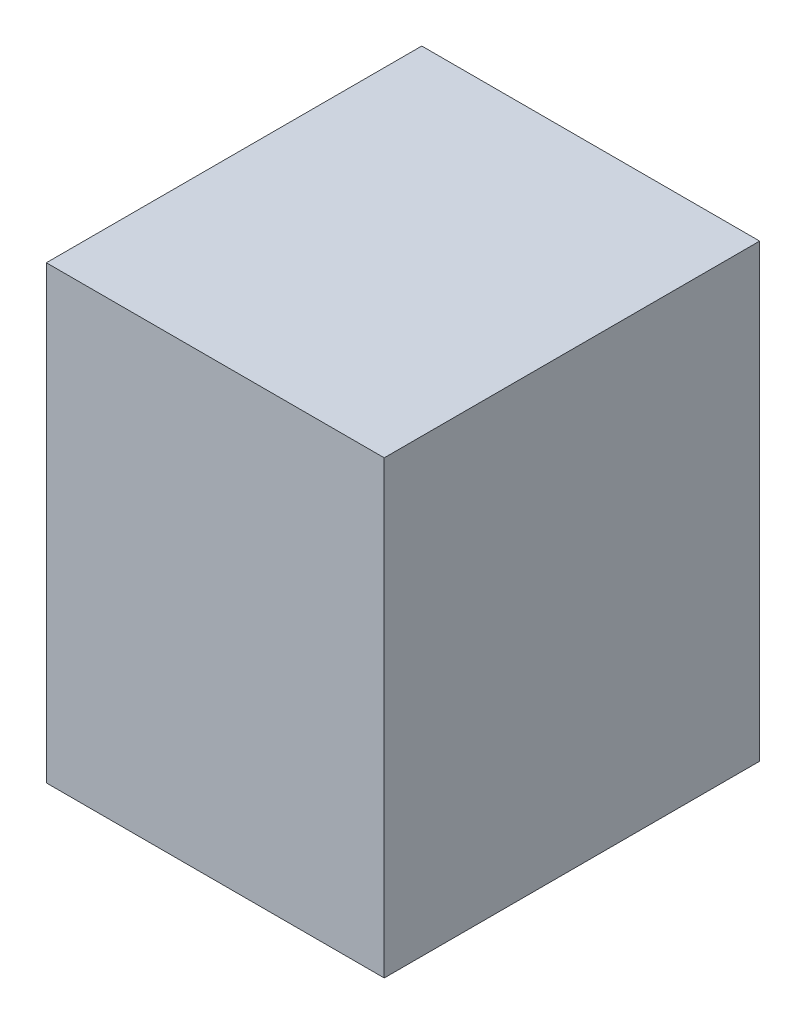
ISO-10303-21;
HEADER;
FILE_DESCRIPTION(('STEP AP214'),'2;1');
FILE_NAME('part.step','',(''),(''),'','','');
FILE_SCHEMA(('AUTOMOTIVE_DESIGN { 1 0 10303 214 1 1 1 1 }'));
ENDSEC;
DATA;
#1=APPLICATION_CONTEXT('core data for automotive mechanical design processes');
#2=APPLICATION_PROTOCOL_DEFINITION('international standard','automotive_design',2000,#1);
#3=PRODUCT_CONTEXT('',#1,'mechanical');
#4=PRODUCT('Part','Part','',(#3));
#5=PRODUCT_RELATED_PRODUCT_CATEGORY('part','',(#4));
#6=PRODUCT_DEFINITION_FORMATION('','',#4);
#7=PRODUCT_DEFINITION_CONTEXT('part definition',#1,'design');
#8=PRODUCT_DEFINITION('design','',#6,#7);
#9=PRODUCT_DEFINITION_SHAPE('','',#8);
#10=(LENGTH_UNIT() NAMED_UNIT(*) SI_UNIT(.MILLI.,.METRE.));
#11=(NAMED_UNIT(*) PLANE_ANGLE_UNIT() SI_UNIT($,.RADIAN.));
#12=(NAMED_UNIT(*) SI_UNIT($,.STERADIAN.) SOLID_ANGLE_UNIT());
#13=UNCERTAINTY_MEASURE_WITH_UNIT(LENGTH_MEASURE(1.E-05),#10,'distance_accuracy_value','');
#14=(GEOMETRIC_REPRESENTATION_CONTEXT(3) GLOBAL_UNCERTAINTY_ASSIGNED_CONTEXT((#13)) GLOBAL_UNIT_ASSIGNED_CONTEXT((#10,
#11,#12)) REPRESENTATION_CONTEXT('',''));
#15=CARTESIAN_POINT('',(0.,0.,0.));
#16=DIRECTION('',(0.,0.,1.));
#17=DIRECTION('',(1.,0.,0.));
#18=AXIS2_PLACEMENT_3D('',#15,#16,#17);
#19=CARTESIAN_POINT('',(0.,0.,63.5));
#20=DIRECTION('',(1.,0.,0.));
#21=DIRECTION('',(0.,0.,-1.));
#22=AXIS2_PLACEMENT_3D('',#19,#20,#21);
#23=PLANE('',#22);
#24=DIRECTION('',(0.,-1.,0.));
#25=VECTOR('',#24,1.);
#26=CARTESIAN_POINT('',(0.,0.,0.));
#27=LINE('',#26,#25);
#28=CARTESIAN_POINT('',(0.,76.2,0.));
#29=VERTEX_POINT('',#28);
#30=CARTESIAN_POINT('',(0.,0.,0.));
#31=VERTEX_POINT('',#30);
#32=EDGE_CURVE('E113',#29,#31,#27,.T.);
#33=ORIENTED_EDGE('',*,*,#32,.T.);
#34=DIRECTION('',(0.,0.,-1.));
#35=VECTOR('',#34,1.);
#36=CARTESIAN_POINT('',(0.,0.,63.5));
#37=LINE('',#36,#35);
#38=CARTESIAN_POINT('',(0.,0.,63.5));
#39=VERTEX_POINT('',#38);
#40=EDGE_CURVE('E11',#39,#31,#37,.T.);
#41=ORIENTED_EDGE('',*,*,#40,.F.);
#42=DIRECTION('',(0.,-1.,0.));
#43=VECTOR('',#42,1.);
#44=CARTESIAN_POINT('',(0.,0.,63.5));
#45=LINE('',#44,#43);
#46=CARTESIAN_POINT('',(0.,76.2,63.5));
#47=VERTEX_POINT('',#46);
#48=EDGE_CURVE('E97',#47,#39,#45,.T.);
#49=ORIENTED_EDGE('',*,*,#48,.F.);
#50=DIRECTION('',(0.,0.,-1.));
#51=VECTOR('',#50,1.);
#52=CARTESIAN_POINT('',(0.,76.2,63.5));
#53=LINE('',#52,#51);
#54=EDGE_CURVE('E109',#47,#29,#53,.T.);
#55=ORIENTED_EDGE('',*,*,#54,.T.);
#56=EDGE_LOOP('',(#33,#41,#49,#55));
#57=FACE_BOUND('',#56,.T.);
#58=ADVANCED_FACE('F45',(#57),#23,.F.);
#59=CARTESIAN_POINT('',(0.,0.,63.5));
#60=DIRECTION('',(0.,1.,0.));
#61=DIRECTION('',(0.,0.,1.));
#62=AXIS2_PLACEMENT_3D('',#59,#60,#61);
#63=PLANE('',#62);
#64=DIRECTION('',(1.,0.,0.));
#65=VECTOR('',#64,1.);
#66=CARTESIAN_POINT('',(0.,0.,0.));
#67=LINE('',#66,#65);
#68=CARTESIAN_POINT('',(57.15,0.,0.));
#69=VERTEX_POINT('',#68);
#70=EDGE_CURVE('E102',#31,#69,#67,.T.);
#71=ORIENTED_EDGE('',*,*,#70,.T.);
#72=DIRECTION('',(0.,0.,-1.));
#73=VECTOR('',#72,1.);
#74=CARTESIAN_POINT('',(57.15,0.,63.5));
#75=LINE('',#74,#73);
#76=CARTESIAN_POINT('',(57.15,0.,63.5));
#77=VERTEX_POINT('',#76);
#78=EDGE_CURVE('E54',#77,#69,#75,.T.);
#79=ORIENTED_EDGE('',*,*,#78,.F.);
#80=DIRECTION('',(1.,0.,0.));
#81=VECTOR('',#80,1.);
#82=CARTESIAN_POINT('',(0.,0.,63.5));
#83=LINE('',#82,#81);
#84=EDGE_CURVE('E92',#39,#77,#83,.T.);
#85=ORIENTED_EDGE('',*,*,#84,.F.);
#86=ORIENTED_EDGE('',*,*,#40,.T.);
#87=EDGE_LOOP('',(#71,#79,#85,#86));
#88=FACE_BOUND('',#87,.T.);
#89=ADVANCED_FACE('F101',(#88),#63,.F.);
#90=CARTESIAN_POINT('',(57.15,0.,63.5));
#91=DIRECTION('',(-1.,0.,0.));
#92=DIRECTION('',(0.,0.,1.));
#93=AXIS2_PLACEMENT_3D('',#90,#91,#92);
#94=PLANE('',#93);
#95=DIRECTION('',(0.,1.,0.));
#96=VECTOR('',#95,1.);
#97=CARTESIAN_POINT('',(57.15,0.,0.));
#98=LINE('',#97,#96);
#99=CARTESIAN_POINT('',(57.15,76.2,0.));
#100=VERTEX_POINT('',#99);
#101=EDGE_CURVE('E79',#69,#100,#98,.T.);
#102=ORIENTED_EDGE('',*,*,#101,.T.);
#103=DIRECTION('',(0.,0.,-1.));
#104=VECTOR('',#103,1.);
#105=CARTESIAN_POINT('',(57.15,76.2,63.5));
#106=LINE('',#105,#104);
#107=CARTESIAN_POINT('',(57.15,76.2,63.5));
#108=VERTEX_POINT('',#107);
#109=EDGE_CURVE('E104',#108,#100,#106,.T.);
#110=ORIENTED_EDGE('',*,*,#109,.F.);
#111=DIRECTION('',(0.,1.,0.));
#112=VECTOR('',#111,1.);
#113=CARTESIAN_POINT('',(57.15,0.,63.5));
#114=LINE('',#113,#112);
#115=EDGE_CURVE('E95',#77,#108,#114,.T.);
#116=ORIENTED_EDGE('',*,*,#115,.F.);
#117=ORIENTED_EDGE('',*,*,#78,.T.);
#118=EDGE_LOOP('',(#102,#110,#116,#117));
#119=FACE_BOUND('',#118,.T.);
#120=ADVANCED_FACE('F105',(#119),#94,.F.);
#121=CARTESIAN_POINT('',(0.,76.2,63.5));
#122=DIRECTION('',(0.,-1.,0.));
#123=DIRECTION('',(0.,0.,-1.));
#124=AXIS2_PLACEMENT_3D('',#121,#122,#123);
#125=PLANE('',#124);
#126=DIRECTION('',(-1.,0.,0.));
#127=VECTOR('',#126,1.);
#128=CARTESIAN_POINT('',(0.,76.2,0.));
#129=LINE('',#128,#127);
#130=EDGE_CURVE('E85',#100,#29,#129,.T.);
#131=ORIENTED_EDGE('',*,*,#130,.T.);
#132=ORIENTED_EDGE('',*,*,#54,.F.);
#133=DIRECTION('',(-1.,0.,0.));
#134=VECTOR('',#133,1.);
#135=CARTESIAN_POINT('',(0.,76.2,63.5));
#136=LINE('',#135,#134);
#137=EDGE_CURVE('E62',#108,#47,#136,.T.);
#138=ORIENTED_EDGE('',*,*,#137,.F.);
#139=ORIENTED_EDGE('',*,*,#109,.T.);
#140=EDGE_LOOP('',(#131,#132,#138,#139));
#141=FACE_BOUND('',#140,.T.);
#142=ADVANCED_FACE('F127',(#141),#125,.F.);
#143=CARTESIAN_POINT('',(0.,0.,63.5));
#144=DIRECTION('',(0.,0.,-1.));
#145=DIRECTION('',(-1.,0.,0.));
#146=AXIS2_PLACEMENT_3D('',#143,#144,#145);
#147=PLANE('',#146);
#148=ORIENTED_EDGE('',*,*,#48,.T.);
#149=ORIENTED_EDGE('',*,*,#84,.T.);
#150=ORIENTED_EDGE('',*,*,#115,.T.);
#151=ORIENTED_EDGE('',*,*,#137,.T.);
#152=EDGE_LOOP('',(#148,#149,#150,#151));
#153=FACE_BOUND('',#152,.T.);
#154=ADVANCED_FACE('F93',(#153),#147,.F.);
#155=CARTESIAN_POINT('',(0.,0.,0.));
#156=DIRECTION('',(0.,0.,-1.));
#157=DIRECTION('',(-1.,0.,0.));
#158=AXIS2_PLACEMENT_3D('',#155,#156,#157);
#159=PLANE('',#158);
#160=CARTESIAN_POINT('',(28.575,38.1,0.));
#161=DIRECTION('',(0.,0.,-1.));
#162=DIRECTION('',(-1.,0.,0.));
#163=AXIS2_PLACEMENT_3D('',#160,#161,#162);
#164=CIRCLE('',#163,22.225);
#165=CARTESIAN_POINT('',(6.35000000000001,38.1,0.));
#166=VERTEX_POINT('',#165);
#167=EDGE_CURVE('E134',#166,#166,#164,.T.);
#168=ORIENTED_EDGE('',*,*,#167,.F.);
#169=EDGE_LOOP('',(#168));
#170=FACE_BOUND('',#169,.T.);
#171=ORIENTED_EDGE('',*,*,#32,.F.);
#172=ORIENTED_EDGE('',*,*,#130,.F.);
#173=ORIENTED_EDGE('',*,*,#101,.F.);
#174=ORIENTED_EDGE('',*,*,#70,.F.);
#175=EDGE_LOOP('',(#171,#172,#173,#174));
#176=FACE_BOUND('',#175,.T.);
#177=ADVANCED_FACE('F130',(#170,#176),#159,.T.);
#178=CARTESIAN_POINT('',(28.575,38.1,29.21));
#179=DIRECTION('',(0.,0.,-1.));
#180=DIRECTION('',(-1.,0.,0.));
#181=AXIS2_PLACEMENT_3D('',#178,#179,#180);
#182=CYLINDRICAL_SURFACE('',#181,22.225);
#183=CARTESIAN_POINT('',(28.575,38.1,29.21));
#184=DIRECTION('',(0.,0.,-1.));
#185=DIRECTION('',(-1.,0.,0.));
#186=AXIS2_PLACEMENT_3D('',#183,#184,#185);
#187=CIRCLE('',#186,22.225);
#188=CARTESIAN_POINT('',(6.35000000000001,38.1,29.21));
#189=VERTEX_POINT('',#188);
#190=EDGE_CURVE('E117',#189,#189,#187,.T.);
#191=CARTESIAN_POINT('',(6.35000000000001,38.1,29.21));
#192=CARTESIAN_POINT('',(6.35000000000001,38.1,28.9057291666667));
#193=CARTESIAN_POINT('',(6.35000000000001,38.1,28.6014583333333));
#194=CARTESIAN_POINT('',(6.35000000000001,38.1,27.9929166666667));
#195=CARTESIAN_POINT('',(6.35000000000001,38.1,27.6886458333333));
#196=CARTESIAN_POINT('',(6.35000000000001,38.1,27.0801041666667));
#197=CARTESIAN_POINT('',(6.35000000000001,38.1,26.7758333333333));
#198=CARTESIAN_POINT('',(6.35000000000001,38.1,26.1672916666667));
#199=CARTESIAN_POINT('',(6.35000000000001,38.1,25.8630208333333));
#200=CARTESIAN_POINT('',(6.35000000000001,38.1,25.2544791666667));
#201=CARTESIAN_POINT('',(6.35000000000001,38.1,24.9502083333333));
#202=CARTESIAN_POINT('',(6.35000000000001,38.1,24.3416666666667));
#203=CARTESIAN_POINT('',(6.35000000000001,38.1,24.0373958333333));
#204=CARTESIAN_POINT('',(6.35000000000001,38.1,23.4288541666667));
#205=CARTESIAN_POINT('',(6.35000000000001,38.1,23.1245833333333));
#206=CARTESIAN_POINT('',(6.35000000000001,38.1,22.5160416666667));
#207=CARTESIAN_POINT('',(6.35000000000001,38.1,22.2117708333333));
#208=CARTESIAN_POINT('',(6.35000000000001,38.1,21.6032291666667));
#209=CARTESIAN_POINT('',(6.35000000000001,38.1,21.2989583333333));
#210=CARTESIAN_POINT('',(6.35000000000001,38.1,20.6904166666667));
#211=CARTESIAN_POINT('',(6.35000000000001,38.1,20.3861458333333));
#212=CARTESIAN_POINT('',(6.35000000000001,38.1,19.7776041666667));
#213=CARTESIAN_POINT('',(6.35000000000001,38.1,19.4733333333333));
#214=CARTESIAN_POINT('',(6.35000000000001,38.1,18.8647916666667));
#215=CARTESIAN_POINT('',(6.35000000000001,38.1,18.5605208333333));
#216=CARTESIAN_POINT('',(6.35000000000001,38.1,17.9519791666667));
#217=CARTESIAN_POINT('',(6.35000000000001,38.1,17.6477083333333));
#218=CARTESIAN_POINT('',(6.35000000000001,38.1,17.0391666666667));
#219=CARTESIAN_POINT('',(6.35000000000001,38.1,16.7348958333333));
#220=CARTESIAN_POINT('',(6.35000000000001,38.1,16.1263541666667));
#221=CARTESIAN_POINT('',(6.35000000000001,38.1,15.8220833333333));
#222=CARTESIAN_POINT('',(6.35000000000001,38.1,15.2135416666667));
#223=CARTESIAN_POINT('',(6.35000000000001,38.1,14.9092708333333));
#224=CARTESIAN_POINT('',(6.35000000000001,38.1,14.3007291666667));
#225=CARTESIAN_POINT('',(6.35000000000001,38.1,13.9964583333333));
#226=CARTESIAN_POINT('',(6.35000000000001,38.1,13.3879166666667));
#227=CARTESIAN_POINT('',(6.35000000000001,38.1,13.0836458333333));
#228=CARTESIAN_POINT('',(6.35000000000001,38.1,12.4751041666667));
#229=CARTESIAN_POINT('',(6.35000000000001,38.1,12.1708333333333));
#230=CARTESIAN_POINT('',(6.35000000000001,38.1,11.5622916666667));
#231=CARTESIAN_POINT('',(6.35000000000001,38.1,11.2580208333333));
#232=CARTESIAN_POINT('',(6.35000000000001,38.1,10.6494791666667));
#233=CARTESIAN_POINT('',(6.35000000000001,38.1,10.3452083333333));
#234=CARTESIAN_POINT('',(6.35000000000001,38.1,9.73666666666667));
#235=CARTESIAN_POINT('',(6.35000000000001,38.1,9.43239583333333));
#236=CARTESIAN_POINT('',(6.35000000000001,38.1,8.82385416666667));
#237=CARTESIAN_POINT('',(6.35000000000001,38.1,8.51958333333334));
#238=CARTESIAN_POINT('',(6.35000000000001,38.1,7.91104166666667));
#239=CARTESIAN_POINT('',(6.35000000000001,38.1,7.60677083333333));
#240=CARTESIAN_POINT('',(6.35000000000001,38.1,6.99822916666667));
#241=CARTESIAN_POINT('',(6.35000000000001,38.1,6.69395833333333));
#242=CARTESIAN_POINT('',(6.35000000000001,38.1,6.08541666666667));
#243=CARTESIAN_POINT('',(6.35000000000001,38.1,5.78114583333333));
#244=CARTESIAN_POINT('',(6.35000000000001,38.1,5.17260416666667));
#245=CARTESIAN_POINT('',(6.35000000000001,38.1,4.86833333333333));
#246=CARTESIAN_POINT('',(6.35000000000001,38.1,4.25979166666667));
#247=CARTESIAN_POINT('',(6.35000000000001,38.1,3.95552083333333));
#248=CARTESIAN_POINT('',(6.35000000000001,38.1,3.34697916666667));
#249=CARTESIAN_POINT('',(6.35000000000001,38.1,3.04270833333333));
#250=CARTESIAN_POINT('',(6.35000000000001,38.1,2.43416666666667));
#251=CARTESIAN_POINT('',(6.35000000000001,38.1,2.12989583333333));
#252=CARTESIAN_POINT('',(6.35000000000001,38.1,1.52135416666667));
#253=CARTESIAN_POINT('',(6.35000000000001,38.1,1.21708333333333));
#254=CARTESIAN_POINT('',(6.35000000000001,38.1,0.608541666666666));
#255=CARTESIAN_POINT('',(6.35000000000001,38.1,0.304270833333333));
#256=CARTESIAN_POINT('',(6.35000000000001,38.1,0.));
#257=B_SPLINE_CURVE_WITH_KNOTS('',3,(#191,#192,#193,#194,#195,#196,#197,#198,#199,#200,#201,
#202,#203,#204,#205,#206,#207,#208,#209,#210,#211,#212,#213,#214,#215,#216,#217,#218,#219,#220,
#221,#222,#223,#224,#225,#226,#227,#228,#229,#230,#231,#232,#233,#234,#235,#236,#237,#238,#239,
#240,#241,#242,#243,#244,#245,#246,#247,#248,#249,#250,#251,#252,#253,#254,#255,#256),
.UNSPECIFIED.,.F.,.F.,(4,2,2,2,2,2,2,2,2,2,2,2,2,2,2,2,2,2,2,2,2,2,2,2,2,2,2,2,2,2,2,2,4),(0.,
0.912812500000002,1.825625,2.7384375,3.65125,4.5640625,5.476875,6.3896875,7.3025,8.2153125,
9.128125,10.0409375,10.95375,11.8665625,12.779375,13.6921875,14.605,15.5178125,16.430625,
17.3434375,18.25625,19.1690625,20.081875,20.9946875,21.9075,22.8203125,23.733125,24.6459375,
25.55875,26.4715625,27.384375,28.2971875,29.21),.UNSPECIFIED.);
#258=EDGE_CURVE('BSEAM144',#189,#166,#257,.T.);
#259=ORIENTED_EDGE('',*,*,#190,.F.);
#260=ORIENTED_EDGE('',*,*,#167,.T.);
#261=ORIENTED_EDGE('',*,*,#258,.T.);
#262=ORIENTED_EDGE('',*,*,#258,.F.);
#263=EDGE_LOOP('',(#259,#261,#260,#262));
#264=FACE_BOUND('',#263,.T.);
#265=ADVANCED_FACE('F144',(#264),#182,.F.);
#266=CARTESIAN_POINT('',(28.575,38.1,29.21));
#267=DIRECTION('',(0.,0.,-1.));
#268=DIRECTION('',(-1.,0.,0.));
#269=AXIS2_PLACEMENT_3D('',#266,#267,#268);
#270=PLANE('',#269);
#271=ORIENTED_EDGE('',*,*,#190,.T.);
#272=EDGE_LOOP('',(#271));
#273=FACE_BOUND('',#272,.T.);
#274=ADVANCED_FACE('F142',(#273),#270,.T.);
#275=CLOSED_SHELL('',(#58,#89,#120,#142,#154,#177,#265,#274));
#276=MANIFOLD_SOLID_BREP('B2',#275);
#277=ADVANCED_BREP_SHAPE_REPRESENTATION('',(#18,#276),#14);
#278=SHAPE_DEFINITION_REPRESENTATION(#9,#277);
ENDSEC;
END-ISO-10303-21;
